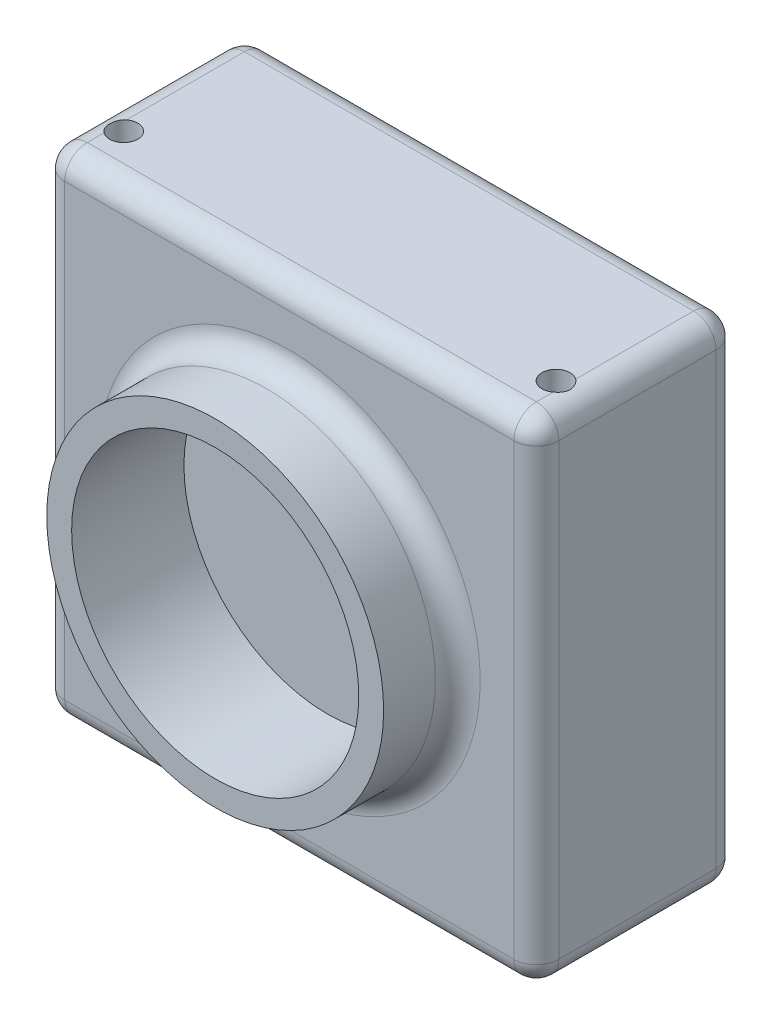
ISO-10303-21;
HEADER;
FILE_DESCRIPTION(('STEP AP214'),'2;1');
FILE_NAME('part.step','',(''),(''),'','','');
FILE_SCHEMA(('AUTOMOTIVE_DESIGN { 1 0 10303 214 1 1 1 1 }'));
ENDSEC;
DATA;
#1=APPLICATION_CONTEXT('core data for automotive mechanical design processes');
#2=APPLICATION_PROTOCOL_DEFINITION('international standard','automotive_design',2000,#1);
#3=PRODUCT_CONTEXT('',#1,'mechanical');
#4=PRODUCT('Part','Part','',(#3));
#5=PRODUCT_RELATED_PRODUCT_CATEGORY('part','',(#4));
#6=PRODUCT_DEFINITION_FORMATION('','',#4);
#7=PRODUCT_DEFINITION_CONTEXT('part definition',#1,'design');
#8=PRODUCT_DEFINITION('design','',#6,#7);
#9=PRODUCT_DEFINITION_SHAPE('','',#8);
#10=(LENGTH_UNIT() NAMED_UNIT(*) SI_UNIT(.MILLI.,.METRE.));
#11=(NAMED_UNIT(*) PLANE_ANGLE_UNIT() SI_UNIT($,.RADIAN.));
#12=(NAMED_UNIT(*) SI_UNIT($,.STERADIAN.) SOLID_ANGLE_UNIT());
#13=UNCERTAINTY_MEASURE_WITH_UNIT(LENGTH_MEASURE(1.E-05),#10,'distance_accuracy_value','');
#14=(GEOMETRIC_REPRESENTATION_CONTEXT(3) GLOBAL_UNCERTAINTY_ASSIGNED_CONTEXT((#13)) GLOBAL_UNIT_ASSIGNED_CONTEXT((#10,
#11,#12)) REPRESENTATION_CONTEXT('',''));
#15=CARTESIAN_POINT('',(0.,0.,0.));
#16=DIRECTION('',(0.,0.,1.));
#17=DIRECTION('',(1.,0.,0.));
#18=AXIS2_PLACEMENT_3D('',#15,#16,#17);
#19=CARTESIAN_POINT('',(22.,-22.,18.));
#20=DIRECTION('',(-1.,0.,0.));
#21=DIRECTION('',(0.,0.,1.));
#22=AXIS2_PLACEMENT_3D('',#19,#20,#21);
#23=PLANE('',#22);
#24=DIRECTION('',(0.,1.,0.));
#25=VECTOR('',#24,1.);
#26=CARTESIAN_POINT('',(22.,-22.,16.));
#27=LINE('',#26,#25);
#28=CARTESIAN_POINT('',(22.,20.,16.));
#29=VERTEX_POINT('',#28);
#30=CARTESIAN_POINT('',(22.,-20.,16.));
#31=VERTEX_POINT('',#30);
#32=EDGE_CURVE('E218',#29,#31,#27,.F.);
#33=ORIENTED_EDGE('',*,*,#32,.T.);
#34=DIRECTION('',(0.,0.,-1.));
#35=VECTOR('',#34,1.);
#36=CARTESIAN_POINT('',(22.,-20.,18.));
#37=LINE('',#36,#35);
#38=CARTESIAN_POINT('',(22.,-20.,2.));
#39=VERTEX_POINT('',#38);
#40=EDGE_CURVE('E221',#31,#39,#37,.T.);
#41=ORIENTED_EDGE('',*,*,#40,.T.);
#42=DIRECTION('',(0.,1.,0.));
#43=VECTOR('',#42,1.);
#44=CARTESIAN_POINT('',(22.,22.,2.));
#45=LINE('',#44,#43);
#46=CARTESIAN_POINT('',(22.,20.,2.));
#47=VERTEX_POINT('',#46);
#48=EDGE_CURVE('E216',#39,#47,#45,.T.);
#49=ORIENTED_EDGE('',*,*,#48,.T.);
#50=DIRECTION('',(0.,0.,-1.));
#51=VECTOR('',#50,1.);
#52=CARTESIAN_POINT('',(22.,20.,18.));
#53=LINE('',#52,#51);
#54=EDGE_CURVE('E214',#47,#29,#53,.F.);
#55=ORIENTED_EDGE('',*,*,#54,.T.);
#56=EDGE_LOOP('',(#33,#41,#49,#55));
#57=FACE_BOUND('',#56,.T.);
#58=ADVANCED_FACE('F36',(#57),#23,.F.);
#59=CARTESIAN_POINT('',(-22.,22.,18.));
#60=DIRECTION('',(0.,-1.,0.));
#61=DIRECTION('',(0.,0.,-1.));
#62=AXIS2_PLACEMENT_3D('',#59,#60,#61);
#63=PLANE('',#62);
#64=CARTESIAN_POINT('',(19.25,22.,13.5));
#65=DIRECTION('',(0.,1.,0.));
#66=DIRECTION('',(0.,0.,1.));
#67=AXIS2_PLACEMENT_3D('',#64,#65,#66);
#68=CIRCLE('',#67,1.24999999999999);
#69=CARTESIAN_POINT('',(20.,22.,12.5));
#70=VERTEX_POINT('',#69);
#71=CARTESIAN_POINT('',(20.,22.,14.5));
#72=VERTEX_POINT('',#71);
#73=EDGE_CURVE('E155',#70,#72,#68,.T.);
#74=ORIENTED_EDGE('',*,*,#73,.F.);
#75=DIRECTION('',(0.,0.,-1.));
#76=VECTOR('',#75,1.);
#77=CARTESIAN_POINT('',(20.,22.,18.));
#78=LINE('',#77,#76);
#79=CARTESIAN_POINT('',(20.,22.,2.));
#80=VERTEX_POINT('',#79);
#81=EDGE_CURVE('E212',#70,#80,#78,.T.);
#82=ORIENTED_EDGE('',*,*,#81,.T.);
#83=DIRECTION('',(-1.,0.,0.));
#84=VECTOR('',#83,1.);
#85=CARTESIAN_POINT('',(-22.,22.,2.));
#86=LINE('',#85,#84);
#87=CARTESIAN_POINT('',(-20.,22.,2.));
#88=VERTEX_POINT('',#87);
#89=EDGE_CURVE('E210',#80,#88,#86,.T.);
#90=ORIENTED_EDGE('',*,*,#89,.T.);
#91=DIRECTION('',(0.,0.,-1.));
#92=VECTOR('',#91,1.);
#93=CARTESIAN_POINT('',(-20.,22.,18.));
#94=LINE('',#93,#92);
#95=CARTESIAN_POINT('',(-20.,22.,12.5));
#96=VERTEX_POINT('',#95);
#97=EDGE_CURVE('E208',#88,#96,#94,.F.);
#98=ORIENTED_EDGE('',*,*,#97,.T.);
#99=CARTESIAN_POINT('',(-19.25,22.,13.5));
#100=DIRECTION('',(0.,1.,0.));
#101=DIRECTION('',(0.,0.,1.));
#102=AXIS2_PLACEMENT_3D('',#99,#100,#101);
#103=CIRCLE('',#102,1.24999999999999);
#104=CARTESIAN_POINT('',(-20.,22.,14.5));
#105=VERTEX_POINT('',#104);
#106=EDGE_CURVE('E156',#105,#96,#103,.T.);
#107=ORIENTED_EDGE('',*,*,#106,.F.);
#108=DIRECTION('',(0.,0.,-1.));
#109=VECTOR('',#108,1.);
#110=CARTESIAN_POINT('',(-20.,22.,18.));
#111=LINE('',#110,#109);
#112=CARTESIAN_POINT('',(-20.,22.,16.));
#113=VERTEX_POINT('',#112);
#114=EDGE_CURVE('E201',#105,#113,#111,.F.);
#115=ORIENTED_EDGE('',*,*,#114,.T.);
#116=DIRECTION('',(-1.,0.,0.));
#117=VECTOR('',#116,1.);
#118=CARTESIAN_POINT('',(-22.,22.,16.));
#119=LINE('',#118,#117);
#120=CARTESIAN_POINT('',(20.,22.,16.));
#121=VERTEX_POINT('',#120);
#122=EDGE_CURVE('E203',#113,#121,#119,.F.);
#123=ORIENTED_EDGE('',*,*,#122,.T.);
#124=DIRECTION('',(0.,0.,-1.));
#125=VECTOR('',#124,1.);
#126=CARTESIAN_POINT('',(20.,22.,18.));
#127=LINE('',#126,#125);
#128=EDGE_CURVE('E206',#121,#72,#127,.T.);
#129=ORIENTED_EDGE('',*,*,#128,.T.);
#130=EDGE_LOOP('',(#74,#82,#90,#98,#107,#115,#123,#129));
#131=FACE_BOUND('',#130,.T.);
#132=ADVANCED_FACE('F280',(#131),#63,.F.);
#133=CARTESIAN_POINT('',(-22.,-22.,18.));
#134=DIRECTION('',(1.,0.,0.));
#135=DIRECTION('',(0.,0.,-1.));
#136=AXIS2_PLACEMENT_3D('',#133,#134,#135);
#137=PLANE('',#136);
#138=DIRECTION('',(0.,-1.,0.));
#139=VECTOR('',#138,1.);
#140=CARTESIAN_POINT('',(-22.,-22.,2.));
#141=LINE('',#140,#139);
#142=CARTESIAN_POINT('',(-22.,20.,2.));
#143=VERTEX_POINT('',#142);
#144=CARTESIAN_POINT('',(-22.,-20.,2.));
#145=VERTEX_POINT('',#144);
#146=EDGE_CURVE('E194',#143,#145,#141,.T.);
#147=ORIENTED_EDGE('',*,*,#146,.T.);
#148=DIRECTION('',(0.,0.,-1.));
#149=VECTOR('',#148,1.);
#150=CARTESIAN_POINT('',(-22.,-20.,18.));
#151=LINE('',#150,#149);
#152=CARTESIAN_POINT('',(-22.,-20.,16.));
#153=VERTEX_POINT('',#152);
#154=EDGE_CURVE('E199',#145,#153,#151,.F.);
#155=ORIENTED_EDGE('',*,*,#154,.T.);
#156=DIRECTION('',(0.,-1.,0.));
#157=VECTOR('',#156,1.);
#158=CARTESIAN_POINT('',(-22.,-22.,16.));
#159=LINE('',#158,#157);
#160=CARTESIAN_POINT('',(-22.,20.,16.));
#161=VERTEX_POINT('',#160);
#162=EDGE_CURVE('E196',#153,#161,#159,.F.);
#163=ORIENTED_EDGE('',*,*,#162,.T.);
#164=DIRECTION('',(0.,0.,-1.));
#165=VECTOR('',#164,1.);
#166=CARTESIAN_POINT('',(-22.,20.,18.));
#167=LINE('',#166,#165);
#168=EDGE_CURVE('E192',#161,#143,#167,.T.);
#169=ORIENTED_EDGE('',*,*,#168,.T.);
#170=EDGE_LOOP('',(#147,#155,#163,#169));
#171=FACE_BOUND('',#170,.T.);
#172=ADVANCED_FACE('F276',(#171),#137,.F.);
#173=CARTESIAN_POINT('',(-22.,-22.,18.));
#174=DIRECTION('',(0.,1.,0.));
#175=DIRECTION('',(0.,0.,1.));
#176=AXIS2_PLACEMENT_3D('',#173,#174,#175);
#177=PLANE('',#176);
#178=DIRECTION('',(1.,0.,0.));
#179=VECTOR('',#178,1.);
#180=CARTESIAN_POINT('',(22.,-22.,2.));
#181=LINE('',#180,#179);
#182=CARTESIAN_POINT('',(-20.,-22.,2.));
#183=VERTEX_POINT('',#182);
#184=CARTESIAN_POINT('',(20.,-22.,2.));
#185=VERTEX_POINT('',#184);
#186=EDGE_CURVE('E185',#183,#185,#181,.T.);
#187=ORIENTED_EDGE('',*,*,#186,.T.);
#188=DIRECTION('',(0.,0.,-1.));
#189=VECTOR('',#188,1.);
#190=CARTESIAN_POINT('',(20.,-22.,18.));
#191=LINE('',#190,#189);
#192=CARTESIAN_POINT('',(20.,-22.,16.));
#193=VERTEX_POINT('',#192);
#194=EDGE_CURVE('E190',#185,#193,#191,.F.);
#195=ORIENTED_EDGE('',*,*,#194,.T.);
#196=DIRECTION('',(1.,0.,0.));
#197=VECTOR('',#196,1.);
#198=CARTESIAN_POINT('',(-22.,-22.,16.));
#199=LINE('',#198,#197);
#200=CARTESIAN_POINT('',(-20.,-22.,16.));
#201=VERTEX_POINT('',#200);
#202=EDGE_CURVE('E187',#193,#201,#199,.F.);
#203=ORIENTED_EDGE('',*,*,#202,.T.);
#204=DIRECTION('',(0.,0.,-1.));
#205=VECTOR('',#204,1.);
#206=CARTESIAN_POINT('',(-20.,-22.,18.));
#207=LINE('',#206,#205);
#208=EDGE_CURVE('E183',#201,#183,#207,.T.);
#209=ORIENTED_EDGE('',*,*,#208,.T.);
#210=EDGE_LOOP('',(#187,#195,#203,#209));
#211=FACE_BOUND('',#210,.T.);
#212=ADVANCED_FACE('F270',(#211),#177,.F.);
#213=CARTESIAN_POINT('',(0.,0.,18.));
#214=DIRECTION('',(0.,0.,-1.));
#215=DIRECTION('',(-1.,0.,0.));
#216=AXIS2_PLACEMENT_3D('',#213,#214,#215);
#217=PLANE('',#216);
#218=DIRECTION('',(0.,-1.,0.));
#219=VECTOR('',#218,1.);
#220=CARTESIAN_POINT('',(-20.,0.,18.));
#221=LINE('',#220,#219);
#222=CARTESIAN_POINT('',(-20.,20.,18.));
#223=VERTEX_POINT('',#222);
#224=CARTESIAN_POINT('',(-20.,-20.,18.));
#225=VERTEX_POINT('',#224);
#226=EDGE_CURVE('E178',#223,#225,#221,.T.);
#227=ORIENTED_EDGE('',*,*,#226,.T.);
#228=DIRECTION('',(1.,0.,0.));
#229=VECTOR('',#228,1.);
#230=CARTESIAN_POINT('',(0.,-20.,18.));
#231=LINE('',#230,#229);
#232=CARTESIAN_POINT('',(20.,-20.,18.));
#233=VERTEX_POINT('',#232);
#234=EDGE_CURVE('E180',#225,#233,#231,.T.);
#235=ORIENTED_EDGE('',*,*,#234,.T.);
#236=DIRECTION('',(0.,1.,0.));
#237=VECTOR('',#236,1.);
#238=CARTESIAN_POINT('',(20.,0.,18.));
#239=LINE('',#238,#237);
#240=CARTESIAN_POINT('',(20.,20.,18.));
#241=VERTEX_POINT('',#240);
#242=EDGE_CURVE('E174',#233,#241,#239,.T.);
#243=ORIENTED_EDGE('',*,*,#242,.T.);
#244=DIRECTION('',(-1.,0.,0.));
#245=VECTOR('',#244,1.);
#246=CARTESIAN_POINT('',(0.,20.,18.));
#247=LINE('',#246,#245);
#248=EDGE_CURVE('E176',#241,#223,#247,.T.);
#249=ORIENTED_EDGE('',*,*,#248,.T.);
#250=EDGE_LOOP('',(#227,#235,#243,#249));
#251=FACE_BOUND('',#250,.T.);
#252=CARTESIAN_POINT('',(0.,0.,18.));
#253=DIRECTION('',(0.,0.,-1.));
#254=DIRECTION('',(-1.,0.,0.));
#255=AXIS2_PLACEMENT_3D('',#252,#253,#254);
#256=CIRCLE('',#255,17.);
#257=CARTESIAN_POINT('',(-17.,0.,18.));
#258=VERTEX_POINT('',#257);
#259=EDGE_CURVE('E171',#258,#258,#256,.T.);
#260=ORIENTED_EDGE('',*,*,#259,.T.);
#261=EDGE_LOOP('',(#260));
#262=FACE_BOUND('',#261,.T.);
#263=ADVANCED_FACE('F267',(#251,#262),#217,.F.);
#264=CARTESIAN_POINT('',(0.,0.,0.));
#265=DIRECTION('',(0.,0.,-1.));
#266=DIRECTION('',(-1.,0.,0.));
#267=AXIS2_PLACEMENT_3D('',#264,#265,#266);
#268=PLANE('',#267);
#269=DIRECTION('',(-1.,0.,0.));
#270=VECTOR('',#269,1.);
#271=CARTESIAN_POINT('',(22.,20.,0.));
#272=LINE('',#271,#270);
#273=CARTESIAN_POINT('',(-20.,20.,0.));
#274=VERTEX_POINT('',#273);
#275=CARTESIAN_POINT('',(20.,20.,0.));
#276=VERTEX_POINT('',#275);
#277=EDGE_CURVE('E226',#274,#276,#272,.F.);
#278=ORIENTED_EDGE('',*,*,#277,.T.);
#279=DIRECTION('',(0.,1.,0.));
#280=VECTOR('',#279,1.);
#281=CARTESIAN_POINT('',(20.,-22.,0.));
#282=LINE('',#281,#280);
#283=CARTESIAN_POINT('',(20.,-20.,0.));
#284=VERTEX_POINT('',#283);
#285=EDGE_CURVE('E231',#276,#284,#282,.F.);
#286=ORIENTED_EDGE('',*,*,#285,.T.);
#287=DIRECTION('',(1.,0.,0.));
#288=VECTOR('',#287,1.);
#289=CARTESIAN_POINT('',(-22.,-20.,0.));
#290=LINE('',#289,#288);
#291=CARTESIAN_POINT('',(-20.,-20.,0.));
#292=VERTEX_POINT('',#291);
#293=EDGE_CURVE('E61',#284,#292,#290,.F.);
#294=ORIENTED_EDGE('',*,*,#293,.T.);
#295=DIRECTION('',(0.,-1.,0.));
#296=VECTOR('',#295,1.);
#297=CARTESIAN_POINT('',(-20.,22.,0.));
#298=LINE('',#297,#296);
#299=EDGE_CURVE('E228',#292,#274,#298,.F.);
#300=ORIENTED_EDGE('',*,*,#299,.T.);
#301=EDGE_LOOP('',(#278,#286,#294,#300));
#302=FACE_BOUND('',#301,.T.);
#303=CARTESIAN_POINT('',(0.,-13.,0.));
#304=DIRECTION('',(0.,0.,-1.));
#305=DIRECTION('',(-1.,0.,0.));
#306=AXIS2_PLACEMENT_3D('',#303,#304,#305);
#307=CIRCLE('',#306,4.);
#308=CARTESIAN_POINT('',(-4.,-13.,0.));
#309=VERTEX_POINT('',#308);
#310=EDGE_CURVE('E412',#309,#309,#307,.T.);
#311=ORIENTED_EDGE('',*,*,#310,.F.);
#312=EDGE_LOOP('',(#311));
#313=FACE_BOUND('',#312,.T.);
#314=ADVANCED_FACE('F265',(#302,#313),#268,.T.);
#315=CARTESIAN_POINT('',(0.,0.,24.6));
#316=DIRECTION('',(0.,0.,-1.));
#317=DIRECTION('',(-1.,0.,0.));
#318=AXIS2_PLACEMENT_3D('',#315,#316,#317);
#319=CYLINDRICAL_SURFACE('',#318,15.);
#320=CARTESIAN_POINT('',(0.,0.,20.));
#321=DIRECTION('',(0.,0.,-1.));
#322=DIRECTION('',(-1.,0.,0.));
#323=AXIS2_PLACEMENT_3D('',#320,#321,#322);
#324=CIRCLE('',#323,15.);
#325=CARTESIAN_POINT('',(-15.,0.,20.));
#326=VERTEX_POINT('',#325);
#327=EDGE_CURVE('E223',#326,#326,#324,.F.);
#328=ORIENTED_EDGE('',*,*,#327,.T.);
#329=EDGE_LOOP('',(#328));
#330=FACE_BOUND('',#329,.T.);
#331=CARTESIAN_POINT('',(0.,0.,24.6));
#332=DIRECTION('',(0.,0.,1.));
#333=DIRECTION('',(1.,0.,0.));
#334=AXIS2_PLACEMENT_3D('',#331,#332,#333);
#335=CIRCLE('',#334,15.);
#336=CARTESIAN_POINT('',(15.,0.,24.6));
#337=VERTEX_POINT('',#336);
#338=EDGE_CURVE('E168',#337,#337,#335,.T.);
#339=ORIENTED_EDGE('',*,*,#338,.F.);
#340=EDGE_LOOP('',(#339));
#341=FACE_BOUND('',#340,.T.);
#342=ADVANCED_FACE('F261',(#330,#341),#319,.T.);
#343=CARTESIAN_POINT('',(0.,0.,24.6));
#344=DIRECTION('',(0.,0.,1.));
#345=DIRECTION('',(1.,0.,0.));
#346=AXIS2_PLACEMENT_3D('',#343,#344,#345);
#347=PLANE('',#346);
#348=CARTESIAN_POINT('',(0.,0.,24.6));
#349=DIRECTION('',(0.,0.,1.));
#350=DIRECTION('',(1.,0.,0.));
#351=AXIS2_PLACEMENT_3D('',#348,#349,#350);
#352=CIRCLE('',#351,12.7842072367647);
#353=CARTESIAN_POINT('',(12.7842072367647,0.,24.6));
#354=VERTEX_POINT('',#353);
#355=EDGE_CURVE('E423',#354,#354,#352,.T.);
#356=ORIENTED_EDGE('',*,*,#355,.F.);
#357=EDGE_LOOP('',(#356));
#358=FACE_BOUND('',#357,.T.);
#359=ORIENTED_EDGE('',*,*,#338,.T.);
#360=EDGE_LOOP('',(#359));
#361=FACE_BOUND('',#360,.T.);
#362=ADVANCED_FACE('F257',(#358,#361),#347,.T.);
#363=CARTESIAN_POINT('',(19.25,14.5,13.5));
#364=DIRECTION('',(0.,1.,0.));
#365=DIRECTION('',(0.,0.,1.));
#366=AXIS2_PLACEMENT_3D('',#363,#364,#365);
#367=CONICAL_SURFACE('',#366,1.24999999999999,1.02974425867665);
#368=CARTESIAN_POINT('',(19.25,13.7489242262155,13.5));
#369=VERTEX_POINT('',#368);
#370=VERTEX_LOOP('',#369);
#371=FACE_BOUND('',#370,.T.);
#372=CARTESIAN_POINT('',(19.25,14.5,13.5));
#373=DIRECTION('',(0.,1.,0.));
#374=DIRECTION('',(0.,0.,1.));
#375=AXIS2_PLACEMENT_3D('',#372,#373,#374);
#376=CIRCLE('',#375,1.24999999999999);
#377=CARTESIAN_POINT('',(19.25,14.5,14.75));
#378=VERTEX_POINT('',#377);
#379=EDGE_CURVE('E159',#378,#378,#376,.T.);
#380=ORIENTED_EDGE('',*,*,#379,.T.);
#381=EDGE_LOOP('',(#380));
#382=FACE_BOUND('',#381,.T.);
#383=ADVANCED_FACE('F253',(#371,#382),#367,.F.);
#384=CARTESIAN_POINT('',(19.25,22.,13.5));
#385=DIRECTION('',(0.,1.,0.));
#386=DIRECTION('',(0.,0.,1.));
#387=AXIS2_PLACEMENT_3D('',#384,#385,#386);
#388=CYLINDRICAL_SURFACE('',#387,1.24999999999999);
#389=ORIENTED_EDGE('',*,*,#379,.F.);
#390=EDGE_LOOP('',(#389));
#391=FACE_BOUND('',#390,.T.);
#392=ORIENTED_EDGE('',*,*,#73,.T.);
#393=CARTESIAN_POINT('',(20.,22.,14.5));
#394=CARTESIAN_POINT('',(20.0278424768759,22.0000009214412,14.4791192213279));
#395=CARTESIAN_POINT('',(20.054792634271,21.9994185359292,14.4570878249196));
#396=CARTESIAN_POINT('',(20.1067336807511,21.997318789863,14.4108870957937));
#397=CARTESIAN_POINT('',(20.1317254588039,21.9958018563324,14.3867187438335));
#398=CARTESIAN_POINT('',(20.2034387600187,21.9902032083834,14.3113275975337));
#399=CARTESIAN_POINT('',(20.2470155747513,21.9850717178616,14.2571304305783));
#400=CARTESIAN_POINT('',(20.3245084912378,21.9738877703069,14.1424366572171));
#401=CARTESIAN_POINT('',(20.3584337236947,21.9678361920804,14.0819460790807));
#402=CARTESIAN_POINT('',(20.4158612781319,21.9565067147187,13.9561205106281));
#403=CARTESIAN_POINT('',(20.439363603996,21.9512288152953,13.8907855221171));
#404=CARTESIAN_POINT('',(20.4755658121555,21.9427286132897,13.7558343716124));
#405=CARTESIAN_POINT('',(20.4880731551035,21.9395431868442,13.6861639399258));
#406=CARTESIAN_POINT('',(20.5011565643483,21.9362050713834,13.545645043539));
#407=CARTESIAN_POINT('',(20.501735107545,21.9360517527804,13.4747968264523));
#408=CARTESIAN_POINT('',(20.4911136946595,21.9387710172281,13.3362341053573));
#409=CARTESIAN_POINT('',(20.4802718204681,21.9415516132315,13.2684898667112));
#410=CARTESIAN_POINT('',(20.4477112944778,21.9493155570626,13.1357769757866));
#411=CARTESIAN_POINT('',(20.4259877056033,21.9542999046201,13.0708095979148));
#412=CARTESIAN_POINT('',(20.3719628872303,21.9653014644496,12.9445971592209));
#413=CARTESIAN_POINT('',(20.3395359361262,21.9713305274322,12.8834071316767));
#414=CARTESIAN_POINT('',(20.2650212267063,21.9827193779063,12.7672081311121));
#415=CARTESIAN_POINT('',(20.222944728895,21.9880799343402,12.7121920639958));
#416=CARTESIAN_POINT('',(20.1498363016774,21.9945601414716,12.6314450530582));
#417=CARTESIAN_POINT('',(20.1216498084558,21.9965146720134,12.6031624520613));
#418=CARTESIAN_POINT('',(20.0626995238434,21.9992349869405,12.5494157429027));
#419=CARTESIAN_POINT('',(20.0319378800596,22.0000017516833,12.5239493264612));
#420=CARTESIAN_POINT('',(20.,22.,12.5));
#421=B_SPLINE_CURVE_WITH_KNOTS('',3,(#393,#394,#395,#396,#397,#398,#399,#400,#401,#402,#403,
#404,#405,#406,#407,#408,#409,#410,#411,#412,#413,#414,#415,#416,#417,#418,#419,#420),
.UNSPECIFIED.,.F.,.F.,(4,2,2,2,2,2,2,2,2,2,2,2,2,4),(0.,0.104329571225435,0.208611506415402,
0.416740741616929,0.624672420197405,0.832604021298873,1.04410818459043,1.25556843064497,
1.46059037820032,1.6657054293636,1.87332100053589,2.08069551727477,2.20044712215313,
2.32009983375207),.UNSPECIFIED.);
#422=EDGE_CURVE('E45',#72,#70,#421,.T.);
#423=ORIENTED_EDGE('',*,*,#422,.T.);
#424=EDGE_LOOP('',(#392,#423));
#425=FACE_BOUND('',#424,.T.);
#426=ADVANCED_FACE('F149',(#391,#425),#388,.F.);
#427=CARTESIAN_POINT('',(-19.25,14.5,13.5));
#428=DIRECTION('',(0.,1.,0.));
#429=DIRECTION('',(0.,0.,1.));
#430=AXIS2_PLACEMENT_3D('',#427,#428,#429);
#431=CONICAL_SURFACE('',#430,1.24999999999999,1.02974425867665);
#432=CARTESIAN_POINT('',(-19.25,13.7489242262155,13.5));
#433=VERTEX_POINT('',#432);
#434=VERTEX_LOOP('',#433);
#435=FACE_BOUND('',#434,.T.);
#436=CARTESIAN_POINT('',(-19.25,14.5,13.5));
#437=DIRECTION('',(0.,1.,0.));
#438=DIRECTION('',(0.,0.,1.));
#439=AXIS2_PLACEMENT_3D('',#436,#437,#438);
#440=CIRCLE('',#439,1.24999999999999);
#441=CARTESIAN_POINT('',(-19.25,14.5,14.75));
#442=VERTEX_POINT('',#441);
#443=EDGE_CURVE('E153',#442,#442,#440,.T.);
#444=ORIENTED_EDGE('',*,*,#443,.T.);
#445=EDGE_LOOP('',(#444));
#446=FACE_BOUND('',#445,.T.);
#447=ADVANCED_FACE('F145',(#435,#446),#431,.F.);
#448=CARTESIAN_POINT('',(-19.25,22.,13.5));
#449=DIRECTION('',(0.,1.,0.));
#450=DIRECTION('',(0.,0.,1.));
#451=AXIS2_PLACEMENT_3D('',#448,#449,#450);
#452=CYLINDRICAL_SURFACE('',#451,1.24999999999999);
#453=ORIENTED_EDGE('',*,*,#443,.F.);
#454=EDGE_LOOP('',(#453));
#455=FACE_BOUND('',#454,.T.);
#456=ORIENTED_EDGE('',*,*,#106,.T.);
#457=CARTESIAN_POINT('',(-20.,22.,12.5));
#458=CARTESIAN_POINT('',(-20.027842476876,22.0000009214412,12.5208807786721));
#459=CARTESIAN_POINT('',(-20.054792634271,21.9994185359292,12.5429121750804));
#460=CARTESIAN_POINT('',(-20.1067336807512,21.997318789863,12.5891129042063));
#461=CARTESIAN_POINT('',(-20.1317254588039,21.9958018563324,12.6132812561665));
#462=CARTESIAN_POINT('',(-20.2034387600187,21.9902032083834,12.6886724024663));
#463=CARTESIAN_POINT('',(-20.2470155747513,21.9850717178616,12.7428695694217));
#464=CARTESIAN_POINT('',(-20.3245084912378,21.9738877703069,12.8575633427829));
#465=CARTESIAN_POINT('',(-20.3584337236947,21.9678361920804,12.9180539209193));
#466=CARTESIAN_POINT('',(-20.4158612781319,21.9565067147187,13.0438794893719));
#467=CARTESIAN_POINT('',(-20.439363603996,21.9512288152953,13.109214477883));
#468=CARTESIAN_POINT('',(-20.4755658121555,21.9427286132897,13.2441656283877));
#469=CARTESIAN_POINT('',(-20.4880731551035,21.9395431868442,13.3138360600742));
#470=CARTESIAN_POINT('',(-20.5011565643483,21.9362050713834,13.454354956461));
#471=CARTESIAN_POINT('',(-20.501735107545,21.9360517527804,13.5252031735477));
#472=CARTESIAN_POINT('',(-20.4911136946595,21.9387710172281,13.6637658946427));
#473=CARTESIAN_POINT('',(-20.4802718204681,21.9415516132315,13.7315101332889));
#474=CARTESIAN_POINT('',(-20.4477112944778,21.9493155570626,13.8642230242134));
#475=CARTESIAN_POINT('',(-20.4259877056033,21.9542999046201,13.9291904020852));
#476=CARTESIAN_POINT('',(-20.3719628872303,21.9653014644496,14.0554028407791));
#477=CARTESIAN_POINT('',(-20.3395359361262,21.9713305274322,14.1165928683233));
#478=CARTESIAN_POINT('',(-20.2650212267063,21.9827193779063,14.2327918688879));
#479=CARTESIAN_POINT('',(-20.2229447288949,21.9880799343402,14.2878079360043));
#480=CARTESIAN_POINT('',(-20.1498363016774,21.9945601414716,14.3685549469418));
#481=CARTESIAN_POINT('',(-20.1216498084558,21.9965146720134,14.3968375479387));
#482=CARTESIAN_POINT('',(-20.0626995238434,21.9992349869405,14.4505842570973));
#483=CARTESIAN_POINT('',(-20.0319378800597,22.0000017516833,14.4760506735388));
#484=CARTESIAN_POINT('',(-20.,22.,14.5));
#485=B_SPLINE_CURVE_WITH_KNOTS('',3,(#457,#458,#459,#460,#461,#462,#463,#464,#465,#466,#467,
#468,#469,#470,#471,#472,#473,#474,#475,#476,#477,#478,#479,#480,#481,#482,#483,#484),
.UNSPECIFIED.,.F.,.F.,(4,2,2,2,2,2,2,2,2,2,2,2,2,4),(0.,0.104329571225436,0.208611506415399,
0.416740741616928,0.624672420197401,0.832604021298877,1.04410818459044,1.25556843064498,
1.46059037820033,1.6657054293636,1.87332100053589,2.08069551727477,2.20044712215311,
2.32009983375202),.UNSPECIFIED.);
#486=EDGE_CURVE('E11',#96,#105,#485,.T.);
#487=ORIENTED_EDGE('',*,*,#486,.T.);
#488=EDGE_LOOP('',(#456,#487));
#489=FACE_BOUND('',#488,.T.);
#490=ADVANCED_FACE('F148',(#455,#489),#452,.F.);
#491=CARTESIAN_POINT('',(0.,-13.,-3.4));
#492=DIRECTION('',(0.,0.,1.));
#493=DIRECTION('',(1.,0.,0.));
#494=AXIS2_PLACEMENT_3D('',#491,#492,#493);
#495=CYLINDRICAL_SURFACE('',#494,4.);
#496=CARTESIAN_POINT('',(0.,-13.,-3.4));
#497=DIRECTION('',(0.,0.,-1.));
#498=DIRECTION('',(-1.,0.,0.));
#499=AXIS2_PLACEMENT_3D('',#496,#497,#498);
#500=CIRCLE('',#499,4.);
#501=CARTESIAN_POINT('',(-4.,-13.,-3.4));
#502=VERTEX_POINT('',#501);
#503=EDGE_CURVE('E162',#502,#502,#500,.T.);
#504=ORIENTED_EDGE('',*,*,#503,.F.);
#505=EDGE_LOOP('',(#504));
#506=FACE_BOUND('',#505,.T.);
#507=ORIENTED_EDGE('',*,*,#310,.T.);
#508=EDGE_LOOP('',(#507));
#509=FACE_BOUND('',#508,.T.);
#510=ADVANCED_FACE('F480',(#506,#509),#495,.T.);
#511=CARTESIAN_POINT('',(0.,-13.,-3.4));
#512=DIRECTION('',(0.,0.,-1.));
#513=DIRECTION('',(-1.,0.,0.));
#514=AXIS2_PLACEMENT_3D('',#511,#512,#513);
#515=PLANE('',#514);
#516=ORIENTED_EDGE('',*,*,#503,.T.);
#517=EDGE_LOOP('',(#516));
#518=FACE_BOUND('',#517,.T.);
#519=ADVANCED_FACE('F484',(#518),#515,.T.);
#520=CARTESIAN_POINT('',(-22.,20.,2.));
#521=DIRECTION('',(1.,0.,0.));
#522=DIRECTION('',(0.,0.,-1.));
#523=AXIS2_PLACEMENT_3D('',#520,#521,#522);
#524=CYLINDRICAL_SURFACE('',#523,2.);
#525=CARTESIAN_POINT('',(-20.,20.,2.));
#526=DIRECTION('',(-1.,0.,0.));
#527=DIRECTION('',(0.,0.,1.));
#528=AXIS2_PLACEMENT_3D('',#525,#526,#527);
#529=CIRCLE('',#528,2.);
#530=EDGE_CURVE('E40',#88,#274,#529,.T.);
#531=ORIENTED_EDGE('',*,*,#530,.F.);
#532=ORIENTED_EDGE('',*,*,#89,.F.);
#533=CARTESIAN_POINT('',(20.,20.,2.));
#534=DIRECTION('',(1.,0.,0.));
#535=DIRECTION('',(0.,1.,0.));
#536=AXIS2_PLACEMENT_3D('',#533,#534,#535);
#537=CIRCLE('',#536,2.);
#538=EDGE_CURVE('E357',#276,#80,#537,.T.);
#539=ORIENTED_EDGE('',*,*,#538,.F.);
#540=ORIENTED_EDGE('',*,*,#277,.F.);
#541=EDGE_LOOP('',(#531,#532,#539,#540));
#542=FACE_BOUND('',#541,.T.);
#543=ADVANCED_FACE('F473',(#542),#524,.T.);
#544=CARTESIAN_POINT('',(-20.,20.,2.));
#545=DIRECTION('',(0.,0.,1.));
#546=DIRECTION('',(1.,0.,0.));
#547=AXIS2_PLACEMENT_3D('',#544,#545,#546);
#548=SPHERICAL_SURFACE('',#547,2.);
#549=CARTESIAN_POINT('',(-20.,20.,2.));
#550=DIRECTION('',(0.,0.,-1.));
#551=DIRECTION('',(-1.,0.,0.));
#552=AXIS2_PLACEMENT_3D('',#549,#550,#551);
#553=CIRCLE('',#552,2.);
#554=EDGE_CURVE('E359',#88,#143,#553,.F.);
#555=ORIENTED_EDGE('',*,*,#554,.F.);
#556=ORIENTED_EDGE('',*,*,#530,.T.);
#557=CARTESIAN_POINT('',(-20.,20.,2.));
#558=DIRECTION('',(0.,1.,0.));
#559=DIRECTION('',(-1.,0.,0.));
#560=AXIS2_PLACEMENT_3D('',#557,#558,#559);
#561=CIRCLE('',#560,2.);
#562=EDGE_CURVE('E409',#143,#274,#561,.F.);
#563=ORIENTED_EDGE('',*,*,#562,.F.);
#564=EDGE_LOOP('',(#555,#556,#563));
#565=FACE_BOUND('',#564,.T.);
#566=ADVANCED_FACE('F600',(#565),#548,.T.);
#567=CARTESIAN_POINT('',(20.,20.,2.));
#568=DIRECTION('',(0.,0.,1.));
#569=DIRECTION('',(1.,0.,0.));
#570=AXIS2_PLACEMENT_3D('',#567,#568,#569);
#571=SPHERICAL_SURFACE('',#570,2.);
#572=CARTESIAN_POINT('',(20.,20.,2.));
#573=DIRECTION('',(0.,1.,0.));
#574=DIRECTION('',(0.,0.,1.));
#575=AXIS2_PLACEMENT_3D('',#572,#573,#574);
#576=CIRCLE('',#575,2.);
#577=EDGE_CURVE('E346',#276,#47,#576,.F.);
#578=ORIENTED_EDGE('',*,*,#577,.F.);
#579=ORIENTED_EDGE('',*,*,#538,.T.);
#580=CARTESIAN_POINT('',(20.,20.,2.));
#581=DIRECTION('',(0.,0.,-1.));
#582=DIRECTION('',(-1.,0.,0.));
#583=AXIS2_PLACEMENT_3D('',#580,#581,#582);
#584=CIRCLE('',#583,2.);
#585=EDGE_CURVE('E350',#47,#80,#584,.F.);
#586=ORIENTED_EDGE('',*,*,#585,.F.);
#587=EDGE_LOOP('',(#578,#579,#586));
#588=FACE_BOUND('',#587,.T.);
#589=ADVANCED_FACE('F355',(#588),#571,.T.);
#590=CARTESIAN_POINT('',(-20.,-22.,2.));
#591=DIRECTION('',(0.,1.,0.));
#592=DIRECTION('',(0.,0.,1.));
#593=AXIS2_PLACEMENT_3D('',#590,#591,#592);
#594=CYLINDRICAL_SURFACE('',#593,2.);
#595=ORIENTED_EDGE('',*,*,#562,.T.);
#596=ORIENTED_EDGE('',*,*,#299,.F.);
#597=CARTESIAN_POINT('',(-20.,-20.,2.));
#598=DIRECTION('',(0.,-1.,0.));
#599=DIRECTION('',(0.,0.,-1.));
#600=AXIS2_PLACEMENT_3D('',#597,#598,#599);
#601=CIRCLE('',#600,2.);
#602=EDGE_CURVE('E402',#145,#292,#601,.T.);
#603=ORIENTED_EDGE('',*,*,#602,.F.);
#604=ORIENTED_EDGE('',*,*,#146,.F.);
#605=EDGE_LOOP('',(#595,#596,#603,#604));
#606=FACE_BOUND('',#605,.T.);
#607=ADVANCED_FACE('F467',(#606),#594,.T.);
#608=CARTESIAN_POINT('',(-20.,20.,18.));
#609=DIRECTION('',(0.,0.,-1.));
#610=DIRECTION('',(-1.,0.,0.));
#611=AXIS2_PLACEMENT_3D('',#608,#609,#610);
#612=CYLINDRICAL_SURFACE('',#611,2.);
#613=ORIENTED_EDGE('',*,*,#554,.T.);
#614=ORIENTED_EDGE('',*,*,#168,.F.);
#615=CARTESIAN_POINT('',(-20.,20.,16.));
#616=DIRECTION('',(0.,0.,1.));
#617=DIRECTION('',(1.,0.,0.));
#618=AXIS2_PLACEMENT_3D('',#615,#616,#617);
#619=CIRCLE('',#618,2.);
#620=EDGE_CURVE('E399',#113,#161,#619,.T.);
#621=ORIENTED_EDGE('',*,*,#620,.F.);
#622=ORIENTED_EDGE('',*,*,#114,.F.);
#623=ORIENTED_EDGE('',*,*,#486,.F.);
#624=ORIENTED_EDGE('',*,*,#97,.F.);
#625=EDGE_LOOP('',(#613,#614,#621,#622,#623,#624));
#626=FACE_BOUND('',#625,.T.);
#627=ADVANCED_FACE('F462',(#626),#612,.T.);
#628=CARTESIAN_POINT('',(0.,20.,16.));
#629=DIRECTION('',(-1.,0.,0.));
#630=DIRECTION('',(0.,0.,1.));
#631=AXIS2_PLACEMENT_3D('',#628,#629,#630);
#632=CYLINDRICAL_SURFACE('',#631,2.);
#633=CARTESIAN_POINT('',(20.,20.,16.));
#634=DIRECTION('',(1.,0.,0.));
#635=DIRECTION('',(0.,0.,-1.));
#636=AXIS2_PLACEMENT_3D('',#633,#634,#635);
#637=CIRCLE('',#636,2.);
#638=EDGE_CURVE('E393',#121,#241,#637,.T.);
#639=ORIENTED_EDGE('',*,*,#638,.F.);
#640=ORIENTED_EDGE('',*,*,#122,.F.);
#641=CARTESIAN_POINT('',(-20.,20.,16.));
#642=DIRECTION('',(-1.,0.,0.));
#643=DIRECTION('',(0.,0.,1.));
#644=AXIS2_PLACEMENT_3D('',#641,#642,#643);
#645=CIRCLE('',#644,2.);
#646=EDGE_CURVE('E396',#223,#113,#645,.T.);
#647=ORIENTED_EDGE('',*,*,#646,.F.);
#648=ORIENTED_EDGE('',*,*,#248,.F.);
#649=EDGE_LOOP('',(#639,#640,#647,#648));
#650=FACE_BOUND('',#649,.T.);
#651=ADVANCED_FACE('F340',(#650),#632,.T.);
#652=CARTESIAN_POINT('',(20.,20.,18.));
#653=DIRECTION('',(0.,0.,-1.));
#654=DIRECTION('',(-1.,0.,0.));
#655=AXIS2_PLACEMENT_3D('',#652,#653,#654);
#656=CYLINDRICAL_SURFACE('',#655,2.);
#657=ORIENTED_EDGE('',*,*,#422,.F.);
#658=ORIENTED_EDGE('',*,*,#128,.F.);
#659=CARTESIAN_POINT('',(20.,20.,16.));
#660=DIRECTION('',(0.,0.,1.));
#661=DIRECTION('',(1.,0.,0.));
#662=AXIS2_PLACEMENT_3D('',#659,#660,#661);
#663=CIRCLE('',#662,2.);
#664=EDGE_CURVE('E364',#29,#121,#663,.T.);
#665=ORIENTED_EDGE('',*,*,#664,.F.);
#666=ORIENTED_EDGE('',*,*,#54,.F.);
#667=ORIENTED_EDGE('',*,*,#585,.T.);
#668=ORIENTED_EDGE('',*,*,#81,.F.);
#669=EDGE_LOOP('',(#657,#658,#665,#666,#667,#668));
#670=FACE_BOUND('',#669,.T.);
#671=ADVANCED_FACE('F246',(#670),#656,.T.);
#672=CARTESIAN_POINT('',(20.,-22.,2.));
#673=DIRECTION('',(0.,-1.,0.));
#674=DIRECTION('',(0.,0.,-1.));
#675=AXIS2_PLACEMENT_3D('',#672,#673,#674);
#676=CYLINDRICAL_SURFACE('',#675,2.);
#677=ORIENTED_EDGE('',*,*,#577,.T.);
#678=ORIENTED_EDGE('',*,*,#48,.F.);
#679=CARTESIAN_POINT('',(20.,-20.,2.));
#680=DIRECTION('',(0.,-1.,0.));
#681=DIRECTION('',(0.,0.,-1.));
#682=AXIS2_PLACEMENT_3D('',#679,#680,#681);
#683=CIRCLE('',#682,2.);
#684=EDGE_CURVE('E390',#284,#39,#683,.T.);
#685=ORIENTED_EDGE('',*,*,#684,.F.);
#686=ORIENTED_EDGE('',*,*,#285,.F.);
#687=EDGE_LOOP('',(#677,#678,#685,#686));
#688=FACE_BOUND('',#687,.T.);
#689=ADVANCED_FACE('F333',(#688),#676,.T.);
#690=CARTESIAN_POINT('',(-22.,-20.,2.));
#691=DIRECTION('',(-1.,0.,0.));
#692=DIRECTION('',(0.,0.,1.));
#693=AXIS2_PLACEMENT_3D('',#690,#691,#692);
#694=CYLINDRICAL_SURFACE('',#693,2.);
#695=CARTESIAN_POINT('',(-20.,-20.,2.));
#696=DIRECTION('',(-1.,0.,0.));
#697=DIRECTION('',(0.,0.,1.));
#698=AXIS2_PLACEMENT_3D('',#695,#696,#697);
#699=CIRCLE('',#698,2.);
#700=EDGE_CURVE('E351',#292,#183,#699,.T.);
#701=ORIENTED_EDGE('',*,*,#700,.F.);
#702=ORIENTED_EDGE('',*,*,#293,.F.);
#703=CARTESIAN_POINT('',(20.,-20.,2.));
#704=DIRECTION('',(1.,0.,0.));
#705=DIRECTION('',(0.,0.,-1.));
#706=AXIS2_PLACEMENT_3D('',#703,#704,#705);
#707=CIRCLE('',#706,2.);
#708=EDGE_CURVE('E53',#185,#284,#707,.T.);
#709=ORIENTED_EDGE('',*,*,#708,.F.);
#710=ORIENTED_EDGE('',*,*,#186,.F.);
#711=EDGE_LOOP('',(#701,#702,#709,#710));
#712=FACE_BOUND('',#711,.T.);
#713=ADVANCED_FACE('F330',(#712),#694,.T.);
#714=CARTESIAN_POINT('',(-20.,-20.,2.));
#715=DIRECTION('',(0.,0.,1.));
#716=DIRECTION('',(1.,0.,0.));
#717=AXIS2_PLACEMENT_3D('',#714,#715,#716);
#718=SPHERICAL_SURFACE('',#717,2.);
#719=ORIENTED_EDGE('',*,*,#602,.T.);
#720=ORIENTED_EDGE('',*,*,#700,.T.);
#721=CARTESIAN_POINT('',(-20.,-20.,2.));
#722=DIRECTION('',(0.,0.,-1.));
#723=DIRECTION('',(-1.,0.,0.));
#724=AXIS2_PLACEMENT_3D('',#721,#722,#723);
#725=CIRCLE('',#724,2.);
#726=EDGE_CURVE('E386',#145,#183,#725,.F.);
#727=ORIENTED_EDGE('',*,*,#726,.F.);
#728=EDGE_LOOP('',(#719,#720,#727));
#729=FACE_BOUND('',#728,.T.);
#730=ADVANCED_FACE('F326',(#729),#718,.T.);
#731=CARTESIAN_POINT('',(-20.,20.,16.));
#732=DIRECTION('',(0.,0.,1.));
#733=DIRECTION('',(1.,0.,0.));
#734=AXIS2_PLACEMENT_3D('',#731,#732,#733);
#735=SPHERICAL_SURFACE('',#734,2.);
#736=ORIENTED_EDGE('',*,*,#646,.T.);
#737=ORIENTED_EDGE('',*,*,#620,.T.);
#738=CARTESIAN_POINT('',(-20.,20.,16.));
#739=DIRECTION('',(0.,1.,0.));
#740=DIRECTION('',(0.,0.,1.));
#741=AXIS2_PLACEMENT_3D('',#738,#739,#740);
#742=CIRCLE('',#741,2.);
#743=EDGE_CURVE('E378',#223,#161,#742,.F.);
#744=ORIENTED_EDGE('',*,*,#743,.F.);
#745=EDGE_LOOP('',(#736,#737,#744));
#746=FACE_BOUND('',#745,.T.);
#747=ADVANCED_FACE('F322',(#746),#735,.T.);
#748=CARTESIAN_POINT('',(20.,20.,16.));
#749=DIRECTION('',(0.,0.,1.));
#750=DIRECTION('',(1.,0.,0.));
#751=AXIS2_PLACEMENT_3D('',#748,#749,#750);
#752=SPHERICAL_SURFACE('',#751,2.);
#753=ORIENTED_EDGE('',*,*,#664,.T.);
#754=ORIENTED_EDGE('',*,*,#638,.T.);
#755=CARTESIAN_POINT('',(20.,20.,16.));
#756=DIRECTION('',(0.,1.,0.));
#757=DIRECTION('',(0.,0.,1.));
#758=AXIS2_PLACEMENT_3D('',#755,#756,#757);
#759=CIRCLE('',#758,2.);
#760=EDGE_CURVE('E374',#29,#241,#759,.F.);
#761=ORIENTED_EDGE('',*,*,#760,.F.);
#762=EDGE_LOOP('',(#753,#754,#761));
#763=FACE_BOUND('',#762,.T.);
#764=ADVANCED_FACE('F319',(#763),#752,.T.);
#765=CARTESIAN_POINT('',(20.,-20.,2.));
#766=DIRECTION('',(0.,0.,1.));
#767=DIRECTION('',(1.,0.,0.));
#768=AXIS2_PLACEMENT_3D('',#765,#766,#767);
#769=SPHERICAL_SURFACE('',#768,2.);
#770=ORIENTED_EDGE('',*,*,#708,.T.);
#771=ORIENTED_EDGE('',*,*,#684,.T.);
#772=CARTESIAN_POINT('',(20.,-20.,2.));
#773=DIRECTION('',(0.,0.,-1.));
#774=DIRECTION('',(-1.,0.,0.));
#775=AXIS2_PLACEMENT_3D('',#772,#773,#774);
#776=CIRCLE('',#775,2.);
#777=EDGE_CURVE('E373',#185,#39,#776,.F.);
#778=ORIENTED_EDGE('',*,*,#777,.F.);
#779=EDGE_LOOP('',(#770,#771,#778));
#780=FACE_BOUND('',#779,.T.);
#781=ADVANCED_FACE('F315',(#780),#769,.T.);
#782=CARTESIAN_POINT('',(-20.,-20.,18.));
#783=DIRECTION('',(0.,0.,-1.));
#784=DIRECTION('',(-1.,0.,0.));
#785=AXIS2_PLACEMENT_3D('',#782,#783,#784);
#786=CYLINDRICAL_SURFACE('',#785,2.);
#787=ORIENTED_EDGE('',*,*,#726,.T.);
#788=ORIENTED_EDGE('',*,*,#208,.F.);
#789=CARTESIAN_POINT('',(-20.,-20.,16.));
#790=DIRECTION('',(0.,0.,1.));
#791=DIRECTION('',(1.,0.,0.));
#792=AXIS2_PLACEMENT_3D('',#789,#790,#791);
#793=CIRCLE('',#792,2.);
#794=EDGE_CURVE('E375',#153,#201,#793,.T.);
#795=ORIENTED_EDGE('',*,*,#794,.F.);
#796=ORIENTED_EDGE('',*,*,#154,.F.);
#797=EDGE_LOOP('',(#787,#788,#795,#796));
#798=FACE_BOUND('',#797,.T.);
#799=ADVANCED_FACE('F311',(#798),#786,.T.);
#800=CARTESIAN_POINT('',(-20.,0.,16.));
#801=DIRECTION('',(0.,-1.,0.));
#802=DIRECTION('',(0.,0.,-1.));
#803=AXIS2_PLACEMENT_3D('',#800,#801,#802);
#804=CYLINDRICAL_SURFACE('',#803,2.);
#805=ORIENTED_EDGE('',*,*,#743,.T.);
#806=ORIENTED_EDGE('',*,*,#162,.F.);
#807=CARTESIAN_POINT('',(-20.,-20.,16.));
#808=DIRECTION('',(0.,-1.,0.));
#809=DIRECTION('',(0.,0.,-1.));
#810=AXIS2_PLACEMENT_3D('',#807,#808,#809);
#811=CIRCLE('',#810,2.);
#812=EDGE_CURVE('E381',#225,#153,#811,.T.);
#813=ORIENTED_EDGE('',*,*,#812,.F.);
#814=ORIENTED_EDGE('',*,*,#226,.F.);
#815=EDGE_LOOP('',(#805,#806,#813,#814));
#816=FACE_BOUND('',#815,.T.);
#817=ADVANCED_FACE('F307',(#816),#804,.T.);
#818=CARTESIAN_POINT('',(20.,0.,16.));
#819=DIRECTION('',(0.,1.,0.));
#820=DIRECTION('',(0.,0.,1.));
#821=AXIS2_PLACEMENT_3D('',#818,#819,#820);
#822=CYLINDRICAL_SURFACE('',#821,2.);
#823=ORIENTED_EDGE('',*,*,#760,.T.);
#824=ORIENTED_EDGE('',*,*,#242,.F.);
#825=CARTESIAN_POINT('',(20.,-20.,16.));
#826=DIRECTION('',(0.,-1.,0.));
#827=DIRECTION('',(0.,0.,-1.));
#828=AXIS2_PLACEMENT_3D('',#825,#826,#827);
#829=CIRCLE('',#828,2.);
#830=EDGE_CURVE('E438',#31,#233,#829,.T.);
#831=ORIENTED_EDGE('',*,*,#830,.F.);
#832=ORIENTED_EDGE('',*,*,#32,.F.);
#833=EDGE_LOOP('',(#823,#824,#831,#832));
#834=FACE_BOUND('',#833,.T.);
#835=ADVANCED_FACE('F303',(#834),#822,.T.);
#836=CARTESIAN_POINT('',(20.,-20.,18.));
#837=DIRECTION('',(0.,0.,-1.));
#838=DIRECTION('',(-1.,0.,0.));
#839=AXIS2_PLACEMENT_3D('',#836,#837,#838);
#840=CYLINDRICAL_SURFACE('',#839,2.);
#841=ORIENTED_EDGE('',*,*,#777,.T.);
#842=ORIENTED_EDGE('',*,*,#40,.F.);
#843=CARTESIAN_POINT('',(20.,-20.,16.));
#844=DIRECTION('',(0.,0.,1.));
#845=DIRECTION('',(1.,0.,0.));
#846=AXIS2_PLACEMENT_3D('',#843,#844,#845);
#847=CIRCLE('',#846,2.);
#848=EDGE_CURVE('E371',#193,#31,#847,.T.);
#849=ORIENTED_EDGE('',*,*,#848,.F.);
#850=ORIENTED_EDGE('',*,*,#194,.F.);
#851=EDGE_LOOP('',(#841,#842,#849,#850));
#852=FACE_BOUND('',#851,.T.);
#853=ADVANCED_FACE('F299',(#852),#840,.T.);
#854=CARTESIAN_POINT('',(-20.,-20.,16.));
#855=DIRECTION('',(0.,0.,1.));
#856=DIRECTION('',(1.,0.,0.));
#857=AXIS2_PLACEMENT_3D('',#854,#855,#856);
#858=SPHERICAL_SURFACE('',#857,2.);
#859=ORIENTED_EDGE('',*,*,#812,.T.);
#860=ORIENTED_EDGE('',*,*,#794,.T.);
#861=CARTESIAN_POINT('',(-20.,-20.,16.));
#862=DIRECTION('',(-1.,0.,0.));
#863=DIRECTION('',(0.,0.,1.));
#864=AXIS2_PLACEMENT_3D('',#861,#862,#863);
#865=CIRCLE('',#864,2.);
#866=EDGE_CURVE('E431',#225,#201,#865,.F.);
#867=ORIENTED_EDGE('',*,*,#866,.F.);
#868=EDGE_LOOP('',(#859,#860,#867));
#869=FACE_BOUND('',#868,.T.);
#870=ADVANCED_FACE('F295',(#869),#858,.T.);
#871=CARTESIAN_POINT('',(20.,-20.,16.));
#872=DIRECTION('',(0.,0.,1.));
#873=DIRECTION('',(1.,0.,0.));
#874=AXIS2_PLACEMENT_3D('',#871,#872,#873);
#875=SPHERICAL_SURFACE('',#874,2.);
#876=ORIENTED_EDGE('',*,*,#848,.T.);
#877=ORIENTED_EDGE('',*,*,#830,.T.);
#878=CARTESIAN_POINT('',(20.,-20.,16.));
#879=DIRECTION('',(1.,0.,0.));
#880=DIRECTION('',(0.,0.,-1.));
#881=AXIS2_PLACEMENT_3D('',#878,#879,#880);
#882=CIRCLE('',#881,2.);
#883=EDGE_CURVE('E428',#193,#233,#882,.F.);
#884=ORIENTED_EDGE('',*,*,#883,.F.);
#885=EDGE_LOOP('',(#876,#877,#884));
#886=FACE_BOUND('',#885,.T.);
#887=ADVANCED_FACE('F291',(#886),#875,.T.);
#888=CARTESIAN_POINT('',(0.,-20.,16.));
#889=DIRECTION('',(1.,0.,0.));
#890=DIRECTION('',(0.,0.,-1.));
#891=AXIS2_PLACEMENT_3D('',#888,#889,#890);
#892=CYLINDRICAL_SURFACE('',#891,2.);
#893=ORIENTED_EDGE('',*,*,#866,.T.);
#894=ORIENTED_EDGE('',*,*,#202,.F.);
#895=ORIENTED_EDGE('',*,*,#883,.T.);
#896=ORIENTED_EDGE('',*,*,#234,.F.);
#897=EDGE_LOOP('',(#893,#894,#895,#896));
#898=FACE_BOUND('',#897,.T.);
#899=ADVANCED_FACE('F288',(#898),#892,.T.);
#900=CARTESIAN_POINT('',(0.,0.,20.));
#901=DIRECTION('',(0.,0.,-1.));
#902=DIRECTION('',(-1.,0.,0.));
#903=AXIS2_PLACEMENT_3D('',#900,#901,#902);
#904=TOROIDAL_SURFACE('',#903,17.,2.);
#905=ORIENTED_EDGE('',*,*,#259,.F.);
#906=EDGE_LOOP('',(#905));
#907=FACE_BOUND('',#906,.T.);
#908=ORIENTED_EDGE('',*,*,#327,.F.);
#909=EDGE_LOOP('',(#908));
#910=FACE_BOUND('',#909,.T.);
#911=ADVANCED_FACE('F38',(#907,#910),#904,.F.);
#912=CARTESIAN_POINT('',(0.,0.,14.6));
#913=DIRECTION('',(0.,0.,1.));
#914=DIRECTION('',(1.,0.,0.));
#915=AXIS2_PLACEMENT_3D('',#912,#913,#914);
#916=CYLINDRICAL_SURFACE('',#915,12.7842072367647);
#917=CARTESIAN_POINT('',(0.,0.,14.6));
#918=DIRECTION('',(0.,0.,1.));
#919=DIRECTION('',(1.,0.,0.));
#920=AXIS2_PLACEMENT_3D('',#917,#918,#919);
#921=CIRCLE('',#920,12.7842072367647);
#922=CARTESIAN_POINT('',(12.7842072367647,0.,14.6));
#923=VERTEX_POINT('',#922);
#924=EDGE_CURVE('E426',#923,#923,#921,.T.);
#925=ORIENTED_EDGE('',*,*,#924,.F.);
#926=EDGE_LOOP('',(#925));
#927=FACE_BOUND('',#926,.T.);
#928=ORIENTED_EDGE('',*,*,#355,.T.);
#929=EDGE_LOOP('',(#928));
#930=FACE_BOUND('',#929,.T.);
#931=ADVANCED_FACE('F492',(#927,#930),#916,.F.);
#932=CARTESIAN_POINT('',(0.,0.,14.6));
#933=DIRECTION('',(0.,0.,1.));
#934=DIRECTION('',(1.,0.,0.));
#935=AXIS2_PLACEMENT_3D('',#932,#933,#934);
#936=PLANE('',#935);
#937=ORIENTED_EDGE('',*,*,#924,.T.);
#938=EDGE_LOOP('',(#937));
#939=FACE_BOUND('',#938,.T.);
#940=ADVANCED_FACE('F495',(#939),#936,.T.);
#941=CLOSED_SHELL('',(#58,#132,#172,#212,#263,#314,#342,#362,#383,#426,#447,#490,#510,#519,#543,
#566,#589,#607,#627,#651,#671,#689,#713,#730,#747,#764,#781,#799,#817,#835,#853,#870,#887,#899,
#911,#931,#940));
#942=MANIFOLD_SOLID_BREP('B2',#941);
#943=ADVANCED_BREP_SHAPE_REPRESENTATION('',(#18,#942),#14);
#944=SHAPE_DEFINITION_REPRESENTATION(#9,#943);
ENDSEC;
END-ISO-10303-21;
